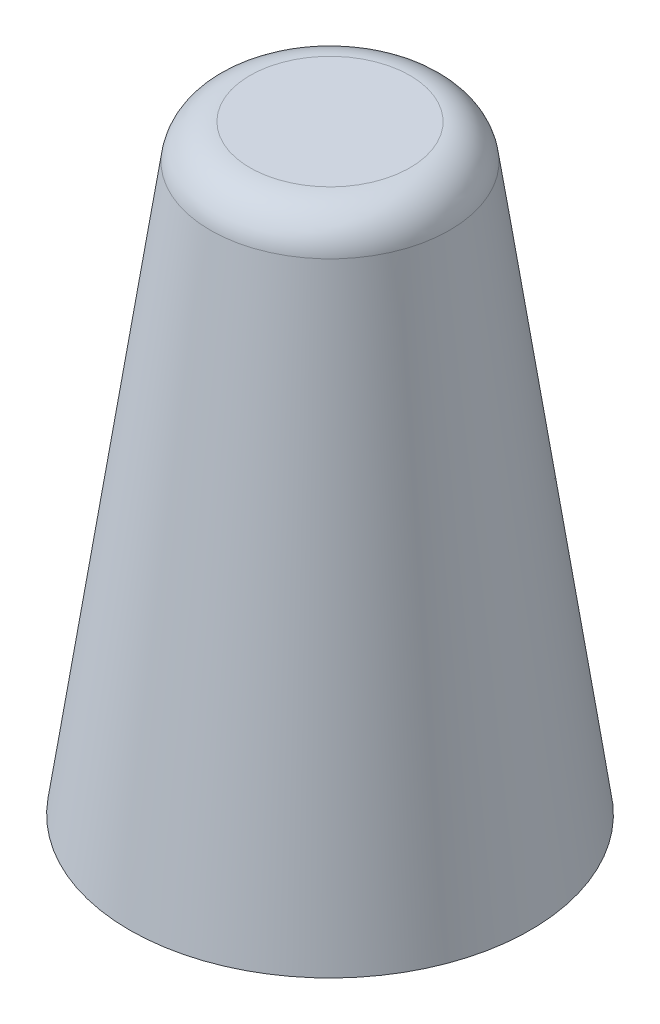
ISO-10303-21;
HEADER;
FILE_DESCRIPTION(('STEP AP214'),'2;1');
FILE_NAME('part.step','',(''),(''),'','','');
FILE_SCHEMA(('AUTOMOTIVE_DESIGN { 1 0 10303 214 1 1 1 1 }'));
ENDSEC;
DATA;
#1=APPLICATION_CONTEXT('core data for automotive mechanical design processes');
#2=APPLICATION_PROTOCOL_DEFINITION('international standard','automotive_design',2000,#1);
#3=PRODUCT_CONTEXT('',#1,'mechanical');
#4=PRODUCT('Part','Part','',(#3));
#5=PRODUCT_RELATED_PRODUCT_CATEGORY('part','',(#4));
#6=PRODUCT_DEFINITION_FORMATION('','',#4);
#7=PRODUCT_DEFINITION_CONTEXT('part definition',#1,'design');
#8=PRODUCT_DEFINITION('design','',#6,#7);
#9=PRODUCT_DEFINITION_SHAPE('','',#8);
#10=(LENGTH_UNIT() NAMED_UNIT(*) SI_UNIT(.MILLI.,.METRE.));
#11=(NAMED_UNIT(*) PLANE_ANGLE_UNIT() SI_UNIT($,.RADIAN.));
#12=(NAMED_UNIT(*) SI_UNIT($,.STERADIAN.) SOLID_ANGLE_UNIT());
#13=UNCERTAINTY_MEASURE_WITH_UNIT(LENGTH_MEASURE(1.E-05),#10,'distance_accuracy_value','');
#14=(GEOMETRIC_REPRESENTATION_CONTEXT(3) GLOBAL_UNCERTAINTY_ASSIGNED_CONTEXT((#13)) GLOBAL_UNIT_ASSIGNED_CONTEXT((#10,
#11,#12)) REPRESENTATION_CONTEXT('',''));
#15=CARTESIAN_POINT('',(0.,0.,0.));
#16=DIRECTION('',(0.,0.,1.));
#17=DIRECTION('',(1.,0.,0.));
#18=AXIS2_PLACEMENT_3D('',#15,#16,#17);
#19=CARTESIAN_POINT('',(0.,0.,0.));
#20=DIRECTION('',(0.,1.,0.));
#21=DIRECTION('',(0.,0.,1.));
#22=AXIS2_PLACEMENT_3D('',#19,#20,#21);
#23=PLANE('',#22);
#24=CARTESIAN_POINT('',(0.,0.,0.));
#25=DIRECTION('',(0.,1.,0.));
#26=DIRECTION('',(0.,0.,1.));
#27=AXIS2_PLACEMENT_3D('',#24,#25,#26);
#28=CIRCLE('',#27,1.65);
#29=CARTESIAN_POINT('',(0.,0.,1.65));
#30=VERTEX_POINT('',#29);
#31=EDGE_CURVE('E63',#30,#30,#28,.T.);
#32=ORIENTED_EDGE('',*,*,#31,.F.);
#33=EDGE_LOOP('',(#32));
#34=FACE_BOUND('',#33,.T.);
#35=CARTESIAN_POINT('',(0.,0.,0.));
#36=DIRECTION('',(0.,1.,0.));
#37=DIRECTION('',(0.,0.,1.));
#38=AXIS2_PLACEMENT_3D('',#35,#36,#37);
#39=CIRCLE('',#38,0.65);
#40=CARTESIAN_POINT('',(0.,0.,0.65));
#41=VERTEX_POINT('',#40);
#42=EDGE_CURVE('E66',#41,#41,#39,.T.);
#43=ORIENTED_EDGE('',*,*,#42,.T.);
#44=EDGE_LOOP('',(#43));
#45=FACE_BOUND('',#44,.T.);
#46=ADVANCED_FACE('F43',(#34,#45),#23,.F.);
#47=CARTESIAN_POINT('',(0.,14.,0.));
#48=DIRECTION('',(0.,-1.,0.));
#49=DIRECTION('',(0.,0.,-1.));
#50=AXIS2_PLACEMENT_3D('',#47,#48,#49);
#51=CYLINDRICAL_SURFACE('',#50,1.65);
#52=CARTESIAN_POINT('',(0.,8.99999999999996,0.));
#53=DIRECTION('',(0.,1.,0.));
#54=DIRECTION('',(0.,0.,1.));
#55=AXIS2_PLACEMENT_3D('',#52,#53,#54);
#56=CIRCLE('',#55,1.65);
#57=CARTESIAN_POINT('',(0.,8.99999999999996,1.65));
#58=VERTEX_POINT('',#57);
#59=EDGE_CURVE('E54',#58,#58,#56,.F.);
#60=ORIENTED_EDGE('',*,*,#59,.T.);
#61=EDGE_LOOP('',(#60));
#62=FACE_BOUND('',#61,.T.);
#63=ORIENTED_EDGE('',*,*,#31,.T.);
#64=EDGE_LOOP('',(#63));
#65=FACE_BOUND('',#64,.T.);
#66=ADVANCED_FACE('F96',(#62,#65),#51,.T.);
#67=CARTESIAN_POINT('',(0.,14.,0.));
#68=DIRECTION('',(0.,-1.,0.));
#69=DIRECTION('',(0.,0.,-1.));
#70=AXIS2_PLACEMENT_3D('',#67,#68,#69);
#71=CYLINDRICAL_SURFACE('',#70,0.65);
#72=CARTESIAN_POINT('',(0.,14.,0.));
#73=DIRECTION('',(0.,1.,0.));
#74=DIRECTION('',(0.,0.,1.));
#75=AXIS2_PLACEMENT_3D('',#72,#73,#74);
#76=CIRCLE('',#75,0.65);
#77=CARTESIAN_POINT('',(0.,14.,0.65));
#78=VERTEX_POINT('',#77);
#79=EDGE_CURVE('E69',#78,#78,#76,.T.);
#80=ORIENTED_EDGE('',*,*,#79,.T.);
#81=EDGE_LOOP('',(#80));
#82=FACE_BOUND('',#81,.T.);
#83=ORIENTED_EDGE('',*,*,#42,.F.);
#84=EDGE_LOOP('',(#83));
#85=FACE_BOUND('',#84,.T.);
#86=ADVANCED_FACE('F103',(#82,#85),#71,.F.);
#87=CARTESIAN_POINT('',(0.,14.,0.));
#88=DIRECTION('',(0.,1.,0.));
#89=DIRECTION('',(0.,0.,1.));
#90=AXIS2_PLACEMENT_3D('',#87,#88,#89);
#91=PLANE('',#90);
#92=ORIENTED_EDGE('',*,*,#79,.F.);
#93=EDGE_LOOP('',(#92));
#94=FACE_BOUND('',#93,.T.);
#95=ADVANCED_FACE('F124',(#94),#91,.F.);
#96=CARTESIAN_POINT('',(0.,0.,0.));
#97=DIRECTION('',(0.,-1.,0.));
#98=DIRECTION('',(0.,0.,-1.));
#99=AXIS2_PLACEMENT_3D('',#96,#97,#98);
#100=CONICAL_SURFACE('',#99,4.,0.141897054604164);
#101=CARTESIAN_POINT('',(0.,9.93124999999996,0.));
#102=DIRECTION('',(0.,-1.,0.));
#103=DIRECTION('',(0.,0.,-1.));
#104=AXIS2_PLACEMENT_3D('',#101,#102,#103);
#105=CIRCLE('',#104,2.58125000000001);
#106=CARTESIAN_POINT('',(0.,9.93124999999996,-2.58125000000001));
#107=VERTEX_POINT('',#106);
#108=EDGE_CURVE('E58',#107,#107,#105,.F.);
#109=ORIENTED_EDGE('',*,*,#108,.T.);
#110=EDGE_LOOP('',(#109));
#111=FACE_BOUND('',#110,.T.);
#112=CARTESIAN_POINT('',(0.,0.,0.));
#113=DIRECTION('',(0.,-1.,0.));
#114=DIRECTION('',(0.,0.,-1.));
#115=AXIS2_PLACEMENT_3D('',#112,#113,#114);
#116=CIRCLE('',#115,4.);
#117=CARTESIAN_POINT('',(0.,0.,-4.));
#118=VERTEX_POINT('',#117);
#119=EDGE_CURVE('E72',#118,#118,#116,.T.);
#120=ORIENTED_EDGE('',*,*,#119,.T.);
#121=EDGE_LOOP('',(#120));
#122=FACE_BOUND('',#121,.T.);
#123=ADVANCED_FACE('F93',(#111,#122),#100,.F.);
#124=CARTESIAN_POINT('',(0.,0.,0.));
#125=DIRECTION('',(0.,-1.,0.));
#126=DIRECTION('',(0.,0.,-1.));
#127=AXIS2_PLACEMENT_3D('',#124,#125,#126);
#128=PLANE('',#127);
#129=CARTESIAN_POINT('',(0.,0.,0.));
#130=DIRECTION('',(0.,-1.,0.));
#131=DIRECTION('',(0.,0.,-1.));
#132=AXIS2_PLACEMENT_3D('',#129,#130,#131);
#133=CIRCLE('',#132,5.01015254455221);
#134=CARTESIAN_POINT('',(0.,0.,-5.01015254455221));
#135=VERTEX_POINT('',#134);
#136=EDGE_CURVE('E75',#135,#135,#133,.T.);
#137=ORIENTED_EDGE('',*,*,#136,.T.);
#138=EDGE_LOOP('',(#137));
#139=FACE_BOUND('',#138,.T.);
#140=ORIENTED_EDGE('',*,*,#119,.F.);
#141=EDGE_LOOP('',(#140));
#142=FACE_BOUND('',#141,.T.);
#143=ADVANCED_FACE('F79',(#139,#142),#128,.T.);
#144=CARTESIAN_POINT('',(0.,0.,0.));
#145=DIRECTION('',(0.,-1.,0.));
#146=DIRECTION('',(0.,0.,-1.));
#147=AXIS2_PLACEMENT_3D('',#144,#145,#146);
#148=CONICAL_SURFACE('',#147,5.01015254455221,0.141897054604164);
#149=CARTESIAN_POINT('',(0.,14.1414213562373,0.));
#150=DIRECTION('',(0.,-1.,0.));
#151=DIRECTION('',(0.,0.,-1.));
#152=AXIS2_PLACEMENT_3D('',#149,#150,#151);
#153=CIRCLE('',#152,2.98994949366117);
#154=CARTESIAN_POINT('',(0.,14.1414213562373,-2.98994949366117));
#155=VERTEX_POINT('',#154);
#156=EDGE_CURVE('E50',#155,#155,#153,.T.);
#157=ORIENTED_EDGE('',*,*,#156,.T.);
#158=EDGE_LOOP('',(#157));
#159=FACE_BOUND('',#158,.T.);
#160=ORIENTED_EDGE('',*,*,#136,.F.);
#161=EDGE_LOOP('',(#160));
#162=FACE_BOUND('',#161,.T.);
#163=ADVANCED_FACE('F82',(#159,#162),#148,.T.);
#164=CARTESIAN_POINT('',(0.,15.,0.));
#165=DIRECTION('',(0.,-1.,0.));
#166=DIRECTION('',(0.,0.,-1.));
#167=AXIS2_PLACEMENT_3D('',#164,#165,#166);
#168=PLANE('',#167);
#169=CARTESIAN_POINT('',(0.,15.,0.));
#170=DIRECTION('',(0.,-1.,0.));
#171=DIRECTION('',(0.,0.,-1.));
#172=AXIS2_PLACEMENT_3D('',#169,#170,#171);
#173=CIRCLE('',#172,2.);
#174=CARTESIAN_POINT('',(0.,15.,-2.));
#175=VERTEX_POINT('',#174);
#176=EDGE_CURVE('E10',#175,#175,#173,.F.);
#177=ORIENTED_EDGE('',*,*,#176,.T.);
#178=EDGE_LOOP('',(#177));
#179=FACE_BOUND('',#178,.T.);
#180=ADVANCED_FACE('F84',(#179),#168,.F.);
#181=CARTESIAN_POINT('',(0.,14.,0.));
#182=DIRECTION('',(0.,1.,0.));
#183=DIRECTION('',(0.,0.,1.));
#184=AXIS2_PLACEMENT_3D('',#181,#182,#183);
#185=CONICAL_SURFACE('',#184,6.65000000000009,0.785398163397453);
#186=ORIENTED_EDGE('',*,*,#59,.F.);
#187=EDGE_LOOP('',(#186));
#188=FACE_BOUND('',#187,.T.);
#189=ORIENTED_EDGE('',*,*,#108,.F.);
#190=EDGE_LOOP('',(#189));
#191=FACE_BOUND('',#190,.T.);
#192=ADVANCED_FACE('F90',(#188,#191),#185,.T.);
#193=CARTESIAN_POINT('',(0.,14.,0.));
#194=DIRECTION('',(0.,-1.,0.));
#195=DIRECTION('',(0.,0.,-1.));
#196=AXIS2_PLACEMENT_3D('',#193,#194,#195);
#197=TOROIDAL_SURFACE('',#196,2.,1.);
#198=ORIENTED_EDGE('',*,*,#176,.F.);
#199=EDGE_LOOP('',(#198));
#200=FACE_BOUND('',#199,.T.);
#201=ORIENTED_EDGE('',*,*,#156,.F.);
#202=EDGE_LOOP('',(#201));
#203=FACE_BOUND('',#202,.T.);
#204=ADVANCED_FACE('F45',(#200,#203),#197,.T.);
#205=CLOSED_SHELL('',(#46,#66,#86,#95,#123,#143,#163,#180,#192,#204));
#206=MANIFOLD_SOLID_BREP('B2',#205);
#207=ADVANCED_BREP_SHAPE_REPRESENTATION('',(#18,#206),#14);
#208=SHAPE_DEFINITION_REPRESENTATION(#9,#207);
ENDSEC;
END-ISO-10303-21;
